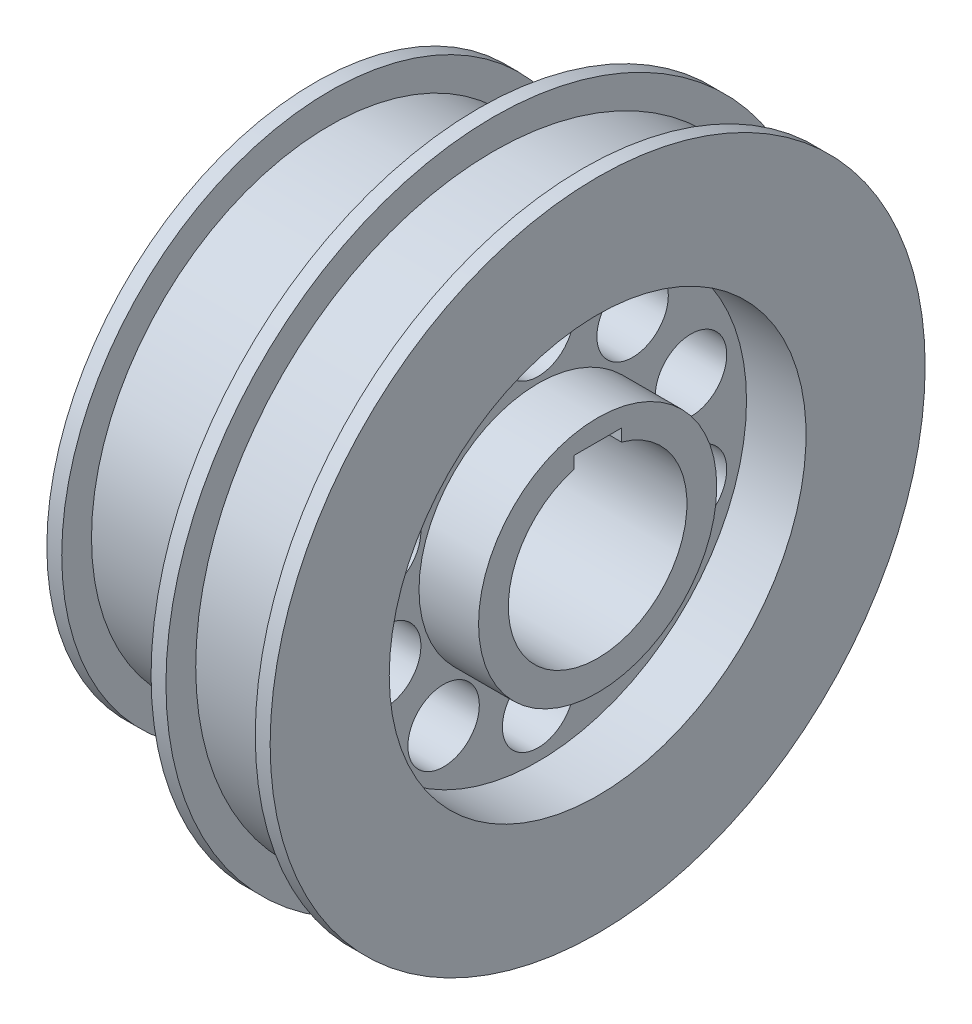
ISO-10303-21;
HEADER;
FILE_DESCRIPTION(('STEP AP214'),'2;1');
FILE_NAME('part.step','',(''),(''),'','','');
FILE_SCHEMA(('AUTOMOTIVE_DESIGN { 1 0 10303 214 1 1 1 1 }'));
ENDSEC;
DATA;
#1=APPLICATION_CONTEXT('core data for automotive mechanical design processes');
#2=APPLICATION_PROTOCOL_DEFINITION('international standard','automotive_design',2000,#1);
#3=PRODUCT_CONTEXT('',#1,'mechanical');
#4=PRODUCT('Part','Part','',(#3));
#5=PRODUCT_RELATED_PRODUCT_CATEGORY('part','',(#4));
#6=PRODUCT_DEFINITION_FORMATION('','',#4);
#7=PRODUCT_DEFINITION_CONTEXT('part definition',#1,'design');
#8=PRODUCT_DEFINITION('design','',#6,#7);
#9=PRODUCT_DEFINITION_SHAPE('','',#8);
#10=(LENGTH_UNIT() NAMED_UNIT(*) SI_UNIT(.MILLI.,.METRE.));
#11=(NAMED_UNIT(*) PLANE_ANGLE_UNIT() SI_UNIT($,.RADIAN.));
#12=(NAMED_UNIT(*) SI_UNIT($,.STERADIAN.) SOLID_ANGLE_UNIT());
#13=UNCERTAINTY_MEASURE_WITH_UNIT(LENGTH_MEASURE(1.E-05),#10,'distance_accuracy_value','');
#14=(GEOMETRIC_REPRESENTATION_CONTEXT(3) GLOBAL_UNCERTAINTY_ASSIGNED_CONTEXT((#13)) GLOBAL_UNIT_ASSIGNED_CONTEXT((#10,
#11,#12)) REPRESENTATION_CONTEXT('',''));
#15=CARTESIAN_POINT('',(0.,0.,0.));
#16=DIRECTION('',(0.,0.,1.));
#17=DIRECTION('',(1.,0.,0.));
#18=AXIS2_PLACEMENT_3D('',#15,#16,#17);
#19=CARTESIAN_POINT('',(-5.,0.,0.));
#20=DIRECTION('',(1.,0.,0.));
#21=DIRECTION('',(0.,0.,-1.));
#22=AXIS2_PLACEMENT_3D('',#19,#20,#21);
#23=PLANE('',#22);
#24=CARTESIAN_POINT('',(-5.,27.,0.));
#25=DIRECTION('',(1.,0.,0.));
#26=DIRECTION('',(0.,0.,-1.));
#27=AXIS2_PLACEMENT_3D('',#24,#25,#26);
#28=CIRCLE('',#27,6.);
#29=CARTESIAN_POINT('',(-5.,27.,-6.));
#30=VERTEX_POINT('',#29);
#31=EDGE_CURVE('E111',#30,#30,#28,.T.);
#32=ORIENTED_EDGE('',*,*,#31,.T.);
#33=EDGE_LOOP('',(#32));
#34=FACE_BOUND('',#33,.T.);
#35=CARTESIAN_POINT('',(-5.,21.8434588481267,-15.8702018118978));
#36=DIRECTION('',(1.,0.,0.));
#37=DIRECTION('',(0.,0.,-1.));
#38=AXIS2_PLACEMENT_3D('',#35,#36,#37);
#39=CIRCLE('',#38,6.0000000000001);
#40=CARTESIAN_POINT('',(-5.,21.8434588481267,-21.8702018118979));
#41=VERTEX_POINT('',#40);
#42=EDGE_CURVE('E179',#41,#41,#39,.T.);
#43=ORIENTED_EDGE('',*,*,#42,.T.);
#44=EDGE_LOOP('',(#43));
#45=FACE_BOUND('',#44,.T.);
#46=CARTESIAN_POINT('',(-5.,8.34345884812869,-25.6785259399729));
#47=DIRECTION('',(1.,0.,0.));
#48=DIRECTION('',(0.,0.,-1.));
#49=AXIS2_PLACEMENT_3D('',#46,#47,#48);
#50=CIRCLE('',#49,6.00000000000213);
#51=CARTESIAN_POINT('',(-5.,8.34345884812869,-31.678525939975));
#52=VERTEX_POINT('',#51);
#53=EDGE_CURVE('E176',#52,#52,#50,.T.);
#54=ORIENTED_EDGE('',*,*,#53,.T.);
#55=EDGE_LOOP('',(#54));
#56=FACE_BOUND('',#55,.T.);
#57=CARTESIAN_POINT('',(-5.,-8.34345884811848,-25.6785259399762));
#58=DIRECTION('',(1.,0.,0.));
#59=DIRECTION('',(0.,0.,-1.));
#60=AXIS2_PLACEMENT_3D('',#57,#58,#59);
#61=CIRCLE('',#60,6.00000000000534);
#62=CARTESIAN_POINT('',(-5.,-8.34345884811848,-31.6785259399815));
#63=VERTEX_POINT('',#62);
#64=EDGE_CURVE('E173',#63,#63,#61,.T.);
#65=ORIENTED_EDGE('',*,*,#64,.T.);
#66=EDGE_LOOP('',(#65));
#67=FACE_BOUND('',#66,.T.);
#68=CARTESIAN_POINT('',(-5.,-21.8434588481204,-15.8702018119065));
#69=DIRECTION('',(1.,0.,0.));
#70=DIRECTION('',(0.,0.,-1.));
#71=AXIS2_PLACEMENT_3D('',#68,#69,#70);
#72=CIRCLE('',#71,6.00000000000851);
#73=CARTESIAN_POINT('',(-5.,-21.8434588481204,-21.870201811915));
#74=VERTEX_POINT('',#73);
#75=EDGE_CURVE('E170',#74,#74,#72,.T.);
#76=ORIENTED_EDGE('',*,*,#75,.T.);
#77=EDGE_LOOP('',(#76));
#78=FACE_BOUND('',#77,.T.);
#79=CARTESIAN_POINT('',(-5.,-27.,-1.07334865256196E-11));
#80=DIRECTION('',(1.,0.,0.));
#81=DIRECTION('',(0.,0.,-1.));
#82=AXIS2_PLACEMENT_3D('',#79,#80,#81);
#83=CIRCLE('',#82,6.00000000001045);
#84=CARTESIAN_POINT('',(-5.,-27.,-6.00000000002118));
#85=VERTEX_POINT('',#84);
#86=EDGE_CURVE('E167',#85,#85,#83,.T.);
#87=ORIENTED_EDGE('',*,*,#86,.T.);
#88=EDGE_LOOP('',(#87));
#89=FACE_BOUND('',#88,.T.);
#90=CARTESIAN_POINT('',(-5.,-21.8434588481267,15.8702018118871));
#91=DIRECTION('',(1.,0.,0.));
#92=DIRECTION('',(0.,0.,-1.));
#93=AXIS2_PLACEMENT_3D('',#90,#91,#92);
#94=CIRCLE('',#93,6.00000000001043);
#95=CARTESIAN_POINT('',(-5.,-21.8434588481267,9.87020181187664));
#96=VERTEX_POINT('',#95);
#97=EDGE_CURVE('E164',#96,#96,#94,.T.);
#98=ORIENTED_EDGE('',*,*,#97,.T.);
#99=EDGE_LOOP('',(#98));
#100=FACE_BOUND('',#99,.T.);
#101=CARTESIAN_POINT('',(-5.,-8.34345884812869,25.6785259399621));
#102=DIRECTION('',(1.,0.,0.));
#103=DIRECTION('',(0.,0.,-1.));
#104=AXIS2_PLACEMENT_3D('',#101,#102,#103);
#105=CIRCLE('',#104,6.00000000000846);
#106=CARTESIAN_POINT('',(-5.,-8.34345884812869,19.6785259399537));
#107=VERTEX_POINT('',#106);
#108=EDGE_CURVE('E161',#107,#107,#105,.T.);
#109=ORIENTED_EDGE('',*,*,#108,.T.);
#110=EDGE_LOOP('',(#109));
#111=FACE_BOUND('',#110,.T.);
#112=CARTESIAN_POINT('',(-5.,8.34345884811847,25.6785259399654));
#113=DIRECTION('',(1.,0.,0.));
#114=DIRECTION('',(0.,0.,-1.));
#115=AXIS2_PLACEMENT_3D('',#112,#113,#114);
#116=CIRCLE('',#115,6.00000000000533);
#117=CARTESIAN_POINT('',(-5.,8.34345884811847,19.6785259399601));
#118=VERTEX_POINT('',#117);
#119=EDGE_CURVE('E158',#118,#118,#116,.T.);
#120=ORIENTED_EDGE('',*,*,#119,.T.);
#121=EDGE_LOOP('',(#120));
#122=FACE_BOUND('',#121,.T.);
#123=CARTESIAN_POINT('',(-5.,21.8434588481204,15.8702018118958));
#124=DIRECTION('',(1.,0.,0.));
#125=DIRECTION('',(0.,0.,-1.));
#126=AXIS2_PLACEMENT_3D('',#123,#124,#125);
#127=CIRCLE('',#126,6.00000000000225);
#128=CARTESIAN_POINT('',(-5.,21.8434588481204,9.87020181189351));
#129=VERTEX_POINT('',#128);
#130=EDGE_CURVE('E155',#129,#129,#127,.T.);
#131=ORIENTED_EDGE('',*,*,#130,.T.);
#132=EDGE_LOOP('',(#131));
#133=FACE_BOUND('',#132,.T.);
#134=CARTESIAN_POINT('',(-5.,0.,0.));
#135=DIRECTION('',(1.,0.,0.));
#136=DIRECTION('',(0.,0.,-1.));
#137=AXIS2_PLACEMENT_3D('',#134,#135,#136);
#138=CIRCLE('',#137,20.);
#139=CARTESIAN_POINT('',(-5.,0.,-20.));
#140=VERTEX_POINT('',#139);
#141=EDGE_CURVE('E107',#140,#140,#138,.F.);
#142=ORIENTED_EDGE('',*,*,#141,.F.);
#143=EDGE_LOOP('',(#142));
#144=FACE_BOUND('',#143,.T.);
#145=CARTESIAN_POINT('',(-5.,0.,0.));
#146=DIRECTION('',(1.,0.,0.));
#147=DIRECTION('',(0.,0.,-1.));
#148=AXIS2_PLACEMENT_3D('',#145,#146,#147);
#149=CIRCLE('',#148,35.);
#150=CARTESIAN_POINT('',(-5.,0.,-35.));
#151=VERTEX_POINT('',#150);
#152=EDGE_CURVE('E102',#151,#151,#149,.T.);
#153=ORIENTED_EDGE('',*,*,#152,.F.);
#154=EDGE_LOOP('',(#153));
#155=FACE_BOUND('',#154,.T.);
#156=ADVANCED_FACE('F37',(#34,#45,#56,#67,#78,#89,#100,#111,#122,#133,#144,#155),#23,.F.);
#157=CARTESIAN_POINT('',(5.,0.,0.));
#158=DIRECTION('',(1.,0.,0.));
#159=DIRECTION('',(0.,0.,-1.));
#160=AXIS2_PLACEMENT_3D('',#157,#158,#159);
#161=PLANE('',#160);
#162=CARTESIAN_POINT('',(5.,21.8434588481204,15.8702018118958));
#163=DIRECTION('',(1.,0.,0.));
#164=DIRECTION('',(0.,0.,-1.));
#165=AXIS2_PLACEMENT_3D('',#162,#163,#164);
#166=CIRCLE('',#165,6.00000000000225);
#167=CARTESIAN_POINT('',(5.,21.8434588481204,9.87020181189351));
#168=VERTEX_POINT('',#167);
#169=EDGE_CURVE('E114',#168,#168,#166,.T.);
#170=ORIENTED_EDGE('',*,*,#169,.F.);
#171=EDGE_LOOP('',(#170));
#172=FACE_BOUND('',#171,.T.);
#173=CARTESIAN_POINT('',(5.,-8.34345884812869,25.6785259399621));
#174=DIRECTION('',(1.,0.,0.));
#175=DIRECTION('',(0.,0.,-1.));
#176=AXIS2_PLACEMENT_3D('',#173,#174,#175);
#177=CIRCLE('',#176,6.00000000000846);
#178=CARTESIAN_POINT('',(5.,-8.34345884812869,19.6785259399537));
#179=VERTEX_POINT('',#178);
#180=EDGE_CURVE('E131',#179,#179,#177,.T.);
#181=ORIENTED_EDGE('',*,*,#180,.F.);
#182=EDGE_LOOP('',(#181));
#183=FACE_BOUND('',#182,.T.);
#184=CARTESIAN_POINT('',(5.,-27.,-1.07334865256196E-11));
#185=DIRECTION('',(1.,0.,0.));
#186=DIRECTION('',(0.,0.,-1.));
#187=AXIS2_PLACEMENT_3D('',#184,#185,#186);
#188=CIRCLE('',#187,6.00000000001045);
#189=CARTESIAN_POINT('',(5.,-27.,-6.00000000002118));
#190=VERTEX_POINT('',#189);
#191=EDGE_CURVE('E137',#190,#190,#188,.T.);
#192=ORIENTED_EDGE('',*,*,#191,.F.);
#193=EDGE_LOOP('',(#192));
#194=FACE_BOUND('',#193,.T.);
#195=CARTESIAN_POINT('',(5.,-8.34345884811848,-25.6785259399762));
#196=DIRECTION('',(1.,0.,0.));
#197=DIRECTION('',(0.,0.,-1.));
#198=AXIS2_PLACEMENT_3D('',#195,#196,#197);
#199=CIRCLE('',#198,6.00000000000534);
#200=CARTESIAN_POINT('',(5.,-8.34345884811848,-31.6785259399815));
#201=VERTEX_POINT('',#200);
#202=EDGE_CURVE('E143',#201,#201,#199,.T.);
#203=ORIENTED_EDGE('',*,*,#202,.F.);
#204=EDGE_LOOP('',(#203));
#205=FACE_BOUND('',#204,.T.);
#206=CARTESIAN_POINT('',(5.,21.8434588481267,-15.8702018118978));
#207=DIRECTION('',(1.,0.,0.));
#208=DIRECTION('',(0.,0.,-1.));
#209=AXIS2_PLACEMENT_3D('',#206,#207,#208);
#210=CIRCLE('',#209,6.0000000000001);
#211=CARTESIAN_POINT('',(5.,21.8434588481267,-21.8702018118979));
#212=VERTEX_POINT('',#211);
#213=EDGE_CURVE('E149',#212,#212,#210,.T.);
#214=ORIENTED_EDGE('',*,*,#213,.F.);
#215=EDGE_LOOP('',(#214));
#216=FACE_BOUND('',#215,.T.);
#217=CARTESIAN_POINT('',(5.,27.,0.));
#218=DIRECTION('',(1.,0.,0.));
#219=DIRECTION('',(0.,0.,-1.));
#220=AXIS2_PLACEMENT_3D('',#217,#218,#219);
#221=CIRCLE('',#220,6.);
#222=CARTESIAN_POINT('',(5.,27.,-6.));
#223=VERTEX_POINT('',#222);
#224=EDGE_CURVE('E152',#223,#223,#221,.T.);
#225=ORIENTED_EDGE('',*,*,#224,.F.);
#226=EDGE_LOOP('',(#225));
#227=FACE_BOUND('',#226,.T.);
#228=CARTESIAN_POINT('',(5.,8.34345884812869,-25.6785259399729));
#229=DIRECTION('',(1.,0.,0.));
#230=DIRECTION('',(0.,0.,-1.));
#231=AXIS2_PLACEMENT_3D('',#228,#229,#230);
#232=CIRCLE('',#231,6.00000000000213);
#233=CARTESIAN_POINT('',(5.,8.34345884812869,-31.678525939975));
#234=VERTEX_POINT('',#233);
#235=EDGE_CURVE('E146',#234,#234,#232,.T.);
#236=ORIENTED_EDGE('',*,*,#235,.F.);
#237=EDGE_LOOP('',(#236));
#238=FACE_BOUND('',#237,.T.);
#239=CARTESIAN_POINT('',(5.,-21.8434588481204,-15.8702018119065));
#240=DIRECTION('',(1.,0.,0.));
#241=DIRECTION('',(0.,0.,-1.));
#242=AXIS2_PLACEMENT_3D('',#239,#240,#241);
#243=CIRCLE('',#242,6.00000000000851);
#244=CARTESIAN_POINT('',(5.,-21.8434588481204,-21.870201811915));
#245=VERTEX_POINT('',#244);
#246=EDGE_CURVE('E140',#245,#245,#243,.T.);
#247=ORIENTED_EDGE('',*,*,#246,.F.);
#248=EDGE_LOOP('',(#247));
#249=FACE_BOUND('',#248,.T.);
#250=CARTESIAN_POINT('',(5.,-21.8434588481267,15.8702018118871));
#251=DIRECTION('',(1.,0.,0.));
#252=DIRECTION('',(0.,0.,-1.));
#253=AXIS2_PLACEMENT_3D('',#250,#251,#252);
#254=CIRCLE('',#253,6.00000000001043);
#255=CARTESIAN_POINT('',(5.,-21.8434588481267,9.87020181187664));
#256=VERTEX_POINT('',#255);
#257=EDGE_CURVE('E134',#256,#256,#254,.T.);
#258=ORIENTED_EDGE('',*,*,#257,.F.);
#259=EDGE_LOOP('',(#258));
#260=FACE_BOUND('',#259,.T.);
#261=CARTESIAN_POINT('',(5.,8.34345884811847,25.6785259399654));
#262=DIRECTION('',(1.,0.,0.));
#263=DIRECTION('',(0.,0.,-1.));
#264=AXIS2_PLACEMENT_3D('',#261,#262,#263);
#265=CIRCLE('',#264,6.00000000000533);
#266=CARTESIAN_POINT('',(5.,8.34345884811847,19.6785259399601));
#267=VERTEX_POINT('',#266);
#268=EDGE_CURVE('E128',#267,#267,#265,.T.);
#269=ORIENTED_EDGE('',*,*,#268,.F.);
#270=EDGE_LOOP('',(#269));
#271=FACE_BOUND('',#270,.T.);
#272=CARTESIAN_POINT('',(5.,0.,0.));
#273=DIRECTION('',(1.,0.,0.));
#274=DIRECTION('',(0.,0.,-1.));
#275=AXIS2_PLACEMENT_3D('',#272,#273,#274);
#276=CIRCLE('',#275,20.);
#277=CARTESIAN_POINT('',(5.,0.,-20.));
#278=VERTEX_POINT('',#277);
#279=EDGE_CURVE('E98',#278,#278,#276,.F.);
#280=ORIENTED_EDGE('',*,*,#279,.T.);
#281=EDGE_LOOP('',(#280));
#282=FACE_BOUND('',#281,.T.);
#283=CARTESIAN_POINT('',(5.,0.,0.));
#284=DIRECTION('',(1.,0.,0.));
#285=DIRECTION('',(0.,0.,-1.));
#286=AXIS2_PLACEMENT_3D('',#283,#284,#285);
#287=CIRCLE('',#286,35.);
#288=CARTESIAN_POINT('',(5.,0.,-35.));
#289=VERTEX_POINT('',#288);
#290=EDGE_CURVE('E112',#289,#289,#287,.T.);
#291=ORIENTED_EDGE('',*,*,#290,.T.);
#292=EDGE_LOOP('',(#291));
#293=FACE_BOUND('',#292,.T.);
#294=ADVANCED_FACE('F216',(#172,#183,#194,#205,#216,#227,#238,#249,#260,#271,#282,#293),#161,.T.);
#295=CARTESIAN_POINT('',(-15.,0.,0.));
#296=DIRECTION('',(1.,0.,0.));
#297=DIRECTION('',(0.,0.,-1.));
#298=AXIS2_PLACEMENT_3D('',#295,#296,#297);
#299=CYLINDRICAL_SURFACE('',#298,20.);
#300=CARTESIAN_POINT('',(-12.5,0.,0.));
#301=DIRECTION('',(1.,0.,0.));
#302=DIRECTION('',(0.,0.,-1.));
#303=AXIS2_PLACEMENT_3D('',#300,#301,#302);
#304=CIRCLE('',#303,20.);
#305=CARTESIAN_POINT('',(-12.5,0.,-20.));
#306=VERTEX_POINT('',#305);
#307=EDGE_CURVE('E45',#306,#306,#304,.T.);
#308=ORIENTED_EDGE('',*,*,#307,.T.);
#309=EDGE_LOOP('',(#308));
#310=FACE_BOUND('',#309,.T.);
#311=ORIENTED_EDGE('',*,*,#141,.T.);
#312=EDGE_LOOP('',(#311));
#313=FACE_BOUND('',#312,.T.);
#314=ADVANCED_FACE('F209',(#310,#313),#299,.T.);
#315=CARTESIAN_POINT('',(-15.,0.,0.));
#316=DIRECTION('',(1.,0.,0.));
#317=DIRECTION('',(0.,0.,-1.));
#318=AXIS2_PLACEMENT_3D('',#315,#316,#317);
#319=CYLINDRICAL_SURFACE('',#318,15.);
#320=CARTESIAN_POINT('',(-10.,0.,0.));
#321=DIRECTION('',(-1.,0.,0.));
#322=DIRECTION('',(0.,0.,1.));
#323=AXIS2_PLACEMENT_3D('',#320,#321,#322);
#324=CIRCLE('',#323,15.);
#325=CARTESIAN_POINT('',(-10.,14.456832294801,4.));
#326=VERTEX_POINT('',#325);
#327=CARTESIAN_POINT('',(-10.,14.456832294801,-4.));
#328=VERTEX_POINT('',#327);
#329=EDGE_CURVE('E52',#326,#328,#324,.F.);
#330=ORIENTED_EDGE('',*,*,#329,.F.);
#331=DIRECTION('',(1.,0.,0.));
#332=VECTOR('',#331,1.);
#333=CARTESIAN_POINT('',(-15.,14.456832294801,4.));
#334=LINE('',#333,#332);
#335=CARTESIAN_POINT('',(15.,14.456832294801,4.));
#336=VERTEX_POINT('',#335);
#337=EDGE_CURVE('E99',#326,#336,#334,.T.);
#338=ORIENTED_EDGE('',*,*,#337,.T.);
#339=CARTESIAN_POINT('',(15.,0.,0.));
#340=DIRECTION('',(1.,0.,0.));
#341=DIRECTION('',(0.,0.,-1.));
#342=AXIS2_PLACEMENT_3D('',#339,#340,#341);
#343=CIRCLE('',#342,15.);
#344=CARTESIAN_POINT('',(15.,14.456832294801,-4.));
#345=VERTEX_POINT('',#344);
#346=EDGE_CURVE('E190',#336,#345,#343,.T.);
#347=ORIENTED_EDGE('',*,*,#346,.T.);
#348=DIRECTION('',(1.,0.,0.));
#349=VECTOR('',#348,1.);
#350=CARTESIAN_POINT('',(-15.,14.456832294801,-4.));
#351=LINE('',#350,#349);
#352=EDGE_CURVE('E89',#328,#345,#351,.T.);
#353=ORIENTED_EDGE('',*,*,#352,.F.);
#354=EDGE_LOOP('',(#330,#338,#347,#353));
#355=FACE_BOUND('',#354,.T.);
#356=ADVANCED_FACE('F207',(#355),#319,.F.);
#357=CARTESIAN_POINT('',(-15.,14.456832294801,4.));
#358=DIRECTION('',(0.,0.,1.));
#359=DIRECTION('',(1.,0.,0.));
#360=AXIS2_PLACEMENT_3D('',#357,#358,#359);
#361=PLANE('',#360);
#362=DIRECTION('',(0.,-1.,0.));
#363=VECTOR('',#362,1.);
#364=CARTESIAN_POINT('',(-10.,14.456832294801,4.));
#365=LINE('',#364,#363);
#366=CARTESIAN_POINT('',(-10.,16.5,4.));
#367=VERTEX_POINT('',#366);
#368=EDGE_CURVE('E59',#367,#326,#365,.T.);
#369=ORIENTED_EDGE('',*,*,#368,.F.);
#370=DIRECTION('',(1.,0.,0.));
#371=VECTOR('',#370,1.);
#372=CARTESIAN_POINT('',(-15.,16.5,4.));
#373=LINE('',#372,#371);
#374=CARTESIAN_POINT('',(15.,16.5,4.));
#375=VERTEX_POINT('',#374);
#376=EDGE_CURVE('E88',#367,#375,#373,.T.);
#377=ORIENTED_EDGE('',*,*,#376,.T.);
#378=DIRECTION('',(0.,-1.,0.));
#379=VECTOR('',#378,1.);
#380=CARTESIAN_POINT('',(15.,14.456832294801,4.));
#381=LINE('',#380,#379);
#382=EDGE_CURVE('E196',#375,#336,#381,.T.);
#383=ORIENTED_EDGE('',*,*,#382,.T.);
#384=ORIENTED_EDGE('',*,*,#337,.F.);
#385=EDGE_LOOP('',(#369,#377,#383,#384));
#386=FACE_BOUND('',#385,.T.);
#387=ADVANCED_FACE('F202',(#386),#361,.F.);
#388=CARTESIAN_POINT('',(-15.,16.5,4.));
#389=DIRECTION('',(0.,1.,0.));
#390=DIRECTION('',(0.,0.,1.));
#391=AXIS2_PLACEMENT_3D('',#388,#389,#390);
#392=PLANE('',#391);
#393=DIRECTION('',(0.,0.,1.));
#394=VECTOR('',#393,1.);
#395=CARTESIAN_POINT('',(-10.,16.5,4.));
#396=LINE('',#395,#394);
#397=CARTESIAN_POINT('',(-10.,16.5,-4.));
#398=VERTEX_POINT('',#397);
#399=EDGE_CURVE('E92',#398,#367,#396,.T.);
#400=ORIENTED_EDGE('',*,*,#399,.F.);
#401=DIRECTION('',(1.,0.,0.));
#402=VECTOR('',#401,1.);
#403=CARTESIAN_POINT('',(-15.,16.5,-4.));
#404=LINE('',#403,#402);
#405=CARTESIAN_POINT('',(15.,16.5,-4.));
#406=VERTEX_POINT('',#405);
#407=EDGE_CURVE('E78',#398,#406,#404,.T.);
#408=ORIENTED_EDGE('',*,*,#407,.T.);
#409=DIRECTION('',(0.,0.,1.));
#410=VECTOR('',#409,1.);
#411=CARTESIAN_POINT('',(15.,16.5,4.));
#412=LINE('',#411,#410);
#413=EDGE_CURVE('E194',#406,#375,#412,.T.);
#414=ORIENTED_EDGE('',*,*,#413,.T.);
#415=ORIENTED_EDGE('',*,*,#376,.F.);
#416=EDGE_LOOP('',(#400,#408,#414,#415));
#417=FACE_BOUND('',#416,.T.);
#418=ADVANCED_FACE('F93',(#417),#392,.F.);
#419=CARTESIAN_POINT('',(-15.,14.456832294801,-4.));
#420=DIRECTION('',(0.,0.,-1.));
#421=DIRECTION('',(-1.,0.,0.));
#422=AXIS2_PLACEMENT_3D('',#419,#420,#421);
#423=PLANE('',#422);
#424=DIRECTION('',(0.,1.,0.));
#425=VECTOR('',#424,1.);
#426=CARTESIAN_POINT('',(-10.,14.456832294801,-4.));
#427=LINE('',#426,#425);
#428=EDGE_CURVE('E82',#328,#398,#427,.T.);
#429=ORIENTED_EDGE('',*,*,#428,.F.);
#430=ORIENTED_EDGE('',*,*,#352,.T.);
#431=DIRECTION('',(0.,1.,0.));
#432=VECTOR('',#431,1.);
#433=CARTESIAN_POINT('',(15.,14.456832294801,-4.));
#434=LINE('',#433,#432);
#435=EDGE_CURVE('E84',#345,#406,#434,.T.);
#436=ORIENTED_EDGE('',*,*,#435,.T.);
#437=ORIENTED_EDGE('',*,*,#407,.F.);
#438=EDGE_LOOP('',(#429,#430,#436,#437));
#439=FACE_BOUND('',#438,.T.);
#440=ADVANCED_FACE('F80',(#439),#423,.F.);
#441=ORIENTED_EDGE('',*,*,#279,.F.);
#442=EDGE_LOOP('',(#441));
#443=FACE_BOUND('',#442,.T.);
#444=CARTESIAN_POINT('',(15.,0.,0.));
#445=DIRECTION('',(1.,0.,0.));
#446=DIRECTION('',(0.,0.,-1.));
#447=AXIS2_PLACEMENT_3D('',#444,#445,#446);
#448=CIRCLE('',#447,20.);
#449=CARTESIAN_POINT('',(15.,0.,-20.));
#450=VERTEX_POINT('',#449);
#451=EDGE_CURVE('E199',#450,#450,#448,.T.);
#452=ORIENTED_EDGE('',*,*,#451,.F.);
#453=EDGE_LOOP('',(#452));
#454=FACE_BOUND('',#453,.T.);
#455=ADVANCED_FACE('F217',(#443,#454),#299,.T.);
#456=CARTESIAN_POINT('',(-15.,0.,0.));
#457=DIRECTION('',(1.,0.,0.));
#458=DIRECTION('',(0.,0.,-1.));
#459=AXIS2_PLACEMENT_3D('',#456,#457,#458);
#460=PLANE('',#459);
#461=CARTESIAN_POINT('',(-15.,0.,0.));
#462=DIRECTION('',(1.,0.,0.));
#463=DIRECTION('',(0.,0.,-1.));
#464=AXIS2_PLACEMENT_3D('',#461,#462,#463);
#465=CIRCLE('',#464,17.5);
#466=CARTESIAN_POINT('',(-15.,0.,-17.5));
#467=VERTEX_POINT('',#466);
#468=EDGE_CURVE('E11',#467,#467,#465,.F.);
#469=ORIENTED_EDGE('',*,*,#468,.T.);
#470=EDGE_LOOP('',(#469));
#471=FACE_BOUND('',#470,.T.);
#472=CARTESIAN_POINT('',(-15.,0.,0.));
#473=DIRECTION('',(-1.,0.,0.));
#474=DIRECTION('',(0.,0.,1.));
#475=AXIS2_PLACEMENT_3D('',#472,#473,#474);
#476=CIRCLE('',#475,6.5);
#477=CARTESIAN_POINT('',(-15.,0.,6.5));
#478=VERTEX_POINT('',#477);
#479=EDGE_CURVE('E110',#478,#478,#476,.T.);
#480=ORIENTED_EDGE('',*,*,#479,.F.);
#481=EDGE_LOOP('',(#480));
#482=FACE_BOUND('',#481,.T.);
#483=ADVANCED_FACE('F241',(#471,#482),#460,.F.);
#484=CARTESIAN_POINT('',(15.,0.,0.));
#485=DIRECTION('',(1.,0.,0.));
#486=DIRECTION('',(0.,0.,-1.));
#487=AXIS2_PLACEMENT_3D('',#484,#485,#486);
#488=PLANE('',#487);
#489=ORIENTED_EDGE('',*,*,#451,.T.);
#490=EDGE_LOOP('',(#489));
#491=FACE_BOUND('',#490,.T.);
#492=ORIENTED_EDGE('',*,*,#435,.F.);
#493=ORIENTED_EDGE('',*,*,#346,.F.);
#494=ORIENTED_EDGE('',*,*,#382,.F.);
#495=ORIENTED_EDGE('',*,*,#413,.F.);
#496=EDGE_LOOP('',(#492,#493,#494,#495));
#497=FACE_BOUND('',#496,.T.);
#498=ADVANCED_FACE('F206',(#491,#497),#488,.T.);
#499=CARTESIAN_POINT('',(-10.,0.,0.));
#500=DIRECTION('',(-1.,0.,0.));
#501=DIRECTION('',(0.,0.,1.));
#502=AXIS2_PLACEMENT_3D('',#499,#500,#501);
#503=PLANE('',#502);
#504=CARTESIAN_POINT('',(-10.,0.,0.));
#505=DIRECTION('',(-1.,0.,0.));
#506=DIRECTION('',(0.,0.,1.));
#507=AXIS2_PLACEMENT_3D('',#504,#505,#506);
#508=CIRCLE('',#507,6.5);
#509=CARTESIAN_POINT('',(-10.,0.,6.5));
#510=VERTEX_POINT('',#509);
#511=EDGE_CURVE('E95',#510,#510,#508,.T.);
#512=ORIENTED_EDGE('',*,*,#511,.T.);
#513=EDGE_LOOP('',(#512));
#514=FACE_BOUND('',#513,.T.);
#515=ORIENTED_EDGE('',*,*,#368,.T.);
#516=ORIENTED_EDGE('',*,*,#329,.T.);
#517=ORIENTED_EDGE('',*,*,#428,.T.);
#518=ORIENTED_EDGE('',*,*,#399,.T.);
#519=EDGE_LOOP('',(#515,#516,#517,#518));
#520=FACE_BOUND('',#519,.T.);
#521=ADVANCED_FACE('F97',(#514,#520),#503,.F.);
#522=CARTESIAN_POINT('',(-10.,0.,0.));
#523=DIRECTION('',(-1.,0.,0.));
#524=DIRECTION('',(0.,0.,1.));
#525=AXIS2_PLACEMENT_3D('',#522,#523,#524);
#526=CYLINDRICAL_SURFACE('',#525,6.5);
#527=ORIENTED_EDGE('',*,*,#511,.F.);
#528=EDGE_LOOP('',(#527));
#529=FACE_BOUND('',#528,.T.);
#530=ORIENTED_EDGE('',*,*,#479,.T.);
#531=EDGE_LOOP('',(#530));
#532=FACE_BOUND('',#531,.T.);
#533=ADVANCED_FACE('F233',(#529,#532),#526,.F.);
#534=CARTESIAN_POINT('',(-5.,27.,0.));
#535=DIRECTION('',(1.,0.,0.));
#536=DIRECTION('',(0.,0.,-1.));
#537=AXIS2_PLACEMENT_3D('',#534,#535,#536);
#538=CYLINDRICAL_SURFACE('',#537,6.);
#539=ORIENTED_EDGE('',*,*,#31,.F.);
#540=EDGE_LOOP('',(#539));
#541=FACE_BOUND('',#540,.T.);
#542=ORIENTED_EDGE('',*,*,#224,.T.);
#543=EDGE_LOOP('',(#542));
#544=FACE_BOUND('',#543,.T.);
#545=ADVANCED_FACE('F231',(#541,#544),#538,.F.);
#546=CARTESIAN_POINT('',(-5.,21.8434588481267,-15.8702018118978));
#547=DIRECTION('',(1.,0.,0.));
#548=DIRECTION('',(0.,0.,-1.));
#549=AXIS2_PLACEMENT_3D('',#546,#547,#548);
#550=CYLINDRICAL_SURFACE('',#549,6.0000000000001);
#551=ORIENTED_EDGE('',*,*,#42,.F.);
#552=EDGE_LOOP('',(#551));
#553=FACE_BOUND('',#552,.T.);
#554=ORIENTED_EDGE('',*,*,#213,.T.);
#555=EDGE_LOOP('',(#554));
#556=FACE_BOUND('',#555,.T.);
#557=ADVANCED_FACE('F348',(#553,#556),#550,.F.);
#558=CARTESIAN_POINT('',(-5.,8.34345884812869,-25.6785259399729));
#559=DIRECTION('',(1.,0.,0.));
#560=DIRECTION('',(0.,0.,-1.));
#561=AXIS2_PLACEMENT_3D('',#558,#559,#560);
#562=CYLINDRICAL_SURFACE('',#561,6.00000000000213);
#563=ORIENTED_EDGE('',*,*,#53,.F.);
#564=EDGE_LOOP('',(#563));
#565=FACE_BOUND('',#564,.T.);
#566=ORIENTED_EDGE('',*,*,#235,.T.);
#567=EDGE_LOOP('',(#566));
#568=FACE_BOUND('',#567,.T.);
#569=ADVANCED_FACE('F345',(#565,#568),#562,.F.);
#570=CARTESIAN_POINT('',(-5.,-8.34345884811848,-25.6785259399762));
#571=DIRECTION('',(1.,0.,0.));
#572=DIRECTION('',(0.,0.,-1.));
#573=AXIS2_PLACEMENT_3D('',#570,#571,#572);
#574=CYLINDRICAL_SURFACE('',#573,6.00000000000534);
#575=ORIENTED_EDGE('',*,*,#64,.F.);
#576=EDGE_LOOP('',(#575));
#577=FACE_BOUND('',#576,.T.);
#578=ORIENTED_EDGE('',*,*,#202,.T.);
#579=EDGE_LOOP('',(#578));
#580=FACE_BOUND('',#579,.T.);
#581=ADVANCED_FACE('F341',(#577,#580),#574,.F.);
#582=CARTESIAN_POINT('',(-5.,-21.8434588481204,-15.8702018119065));
#583=DIRECTION('',(1.,0.,0.));
#584=DIRECTION('',(0.,0.,-1.));
#585=AXIS2_PLACEMENT_3D('',#582,#583,#584);
#586=CYLINDRICAL_SURFACE('',#585,6.00000000000851);
#587=ORIENTED_EDGE('',*,*,#75,.F.);
#588=EDGE_LOOP('',(#587));
#589=FACE_BOUND('',#588,.T.);
#590=ORIENTED_EDGE('',*,*,#246,.T.);
#591=EDGE_LOOP('',(#590));
#592=FACE_BOUND('',#591,.T.);
#593=ADVANCED_FACE('F337',(#589,#592),#586,.F.);
#594=CARTESIAN_POINT('',(-5.,-27.,-1.07334865256196E-11));
#595=DIRECTION('',(1.,0.,0.));
#596=DIRECTION('',(0.,0.,-1.));
#597=AXIS2_PLACEMENT_3D('',#594,#595,#596);
#598=CYLINDRICAL_SURFACE('',#597,6.00000000001045);
#599=ORIENTED_EDGE('',*,*,#86,.F.);
#600=EDGE_LOOP('',(#599));
#601=FACE_BOUND('',#600,.T.);
#602=ORIENTED_EDGE('',*,*,#191,.T.);
#603=EDGE_LOOP('',(#602));
#604=FACE_BOUND('',#603,.T.);
#605=ADVANCED_FACE('F333',(#601,#604),#598,.F.);
#606=CARTESIAN_POINT('',(-5.,-21.8434588481267,15.8702018118871));
#607=DIRECTION('',(1.,0.,0.));
#608=DIRECTION('',(0.,0.,-1.));
#609=AXIS2_PLACEMENT_3D('',#606,#607,#608);
#610=CYLINDRICAL_SURFACE('',#609,6.00000000001043);
#611=ORIENTED_EDGE('',*,*,#97,.F.);
#612=EDGE_LOOP('',(#611));
#613=FACE_BOUND('',#612,.T.);
#614=ORIENTED_EDGE('',*,*,#257,.T.);
#615=EDGE_LOOP('',(#614));
#616=FACE_BOUND('',#615,.T.);
#617=ADVANCED_FACE('F329',(#613,#616),#610,.F.);
#618=CARTESIAN_POINT('',(-5.,-8.34345884812869,25.6785259399621));
#619=DIRECTION('',(1.,0.,0.));
#620=DIRECTION('',(0.,0.,-1.));
#621=AXIS2_PLACEMENT_3D('',#618,#619,#620);
#622=CYLINDRICAL_SURFACE('',#621,6.00000000000846);
#623=ORIENTED_EDGE('',*,*,#108,.F.);
#624=EDGE_LOOP('',(#623));
#625=FACE_BOUND('',#624,.T.);
#626=ORIENTED_EDGE('',*,*,#180,.T.);
#627=EDGE_LOOP('',(#626));
#628=FACE_BOUND('',#627,.T.);
#629=ADVANCED_FACE('F325',(#625,#628),#622,.F.);
#630=CARTESIAN_POINT('',(-5.,8.34345884811847,25.6785259399654));
#631=DIRECTION('',(1.,0.,0.));
#632=DIRECTION('',(0.,0.,-1.));
#633=AXIS2_PLACEMENT_3D('',#630,#631,#632);
#634=CYLINDRICAL_SURFACE('',#633,6.00000000000533);
#635=ORIENTED_EDGE('',*,*,#119,.F.);
#636=EDGE_LOOP('',(#635));
#637=FACE_BOUND('',#636,.T.);
#638=ORIENTED_EDGE('',*,*,#268,.T.);
#639=EDGE_LOOP('',(#638));
#640=FACE_BOUND('',#639,.T.);
#641=ADVANCED_FACE('F321',(#637,#640),#634,.F.);
#642=CARTESIAN_POINT('',(-5.,21.8434588481204,15.8702018118958));
#643=DIRECTION('',(1.,0.,0.));
#644=DIRECTION('',(0.,0.,-1.));
#645=AXIS2_PLACEMENT_3D('',#642,#643,#644);
#646=CYLINDRICAL_SURFACE('',#645,6.00000000000225);
#647=ORIENTED_EDGE('',*,*,#130,.F.);
#648=EDGE_LOOP('',(#647));
#649=FACE_BOUND('',#648,.T.);
#650=ORIENTED_EDGE('',*,*,#169,.T.);
#651=EDGE_LOOP('',(#650));
#652=FACE_BOUND('',#651,.T.);
#653=ADVANCED_FACE('F318',(#649,#652),#646,.F.);
#654=CARTESIAN_POINT('',(0.,0.,0.));
#655=DIRECTION('',(-1.,0.,0.));
#656=DIRECTION('',(0.,0.,1.));
#657=AXIS2_PLACEMENT_3D('',#654,#655,#656);
#658=CYLINDRICAL_SURFACE('',#657,35.);
#659=CARTESIAN_POINT('',(-32.5,0.,0.));
#660=DIRECTION('',(-1.,0.,0.));
#661=DIRECTION('',(0.,0.,1.));
#662=AXIS2_PLACEMENT_3D('',#659,#660,#661);
#663=CIRCLE('',#662,35.);
#664=CARTESIAN_POINT('',(-32.5,0.,35.));
#665=VERTEX_POINT('',#664);
#666=EDGE_CURVE('E115',#665,#665,#663,.T.);
#667=ORIENTED_EDGE('',*,*,#666,.T.);
#668=EDGE_LOOP('',(#667));
#669=FACE_BOUND('',#668,.T.);
#670=ORIENTED_EDGE('',*,*,#152,.T.);
#671=EDGE_LOOP('',(#670));
#672=FACE_BOUND('',#671,.T.);
#673=ADVANCED_FACE('F265',(#669,#672),#658,.F.);
#674=ORIENTED_EDGE('',*,*,#290,.F.);
#675=EDGE_LOOP('',(#674));
#676=FACE_BOUND('',#675,.T.);
#677=CARTESIAN_POINT('',(15.,0.,0.));
#678=DIRECTION('',(-1.,0.,0.));
#679=DIRECTION('',(0.,0.,1.));
#680=AXIS2_PLACEMENT_3D('',#677,#678,#679);
#681=CIRCLE('',#680,35.);
#682=CARTESIAN_POINT('',(15.,0.,35.));
#683=VERTEX_POINT('',#682);
#684=EDGE_CURVE('E269',#683,#683,#681,.T.);
#685=ORIENTED_EDGE('',*,*,#684,.F.);
#686=EDGE_LOOP('',(#685));
#687=FACE_BOUND('',#686,.T.);
#688=ADVANCED_FACE('F261',(#676,#687),#658,.F.);
#689=CARTESIAN_POINT('',(-32.5,35.,0.));
#690=DIRECTION('',(1.,0.,0.));
#691=DIRECTION('',(0.,0.,-1.));
#692=AXIS2_PLACEMENT_3D('',#689,#690,#691);
#693=PLANE('',#692);
#694=ORIENTED_EDGE('',*,*,#666,.F.);
#695=EDGE_LOOP('',(#694));
#696=FACE_BOUND('',#695,.T.);
#697=CARTESIAN_POINT('',(-32.5,0.,0.));
#698=DIRECTION('',(-1.,0.,0.));
#699=DIRECTION('',(0.,0.,1.));
#700=AXIS2_PLACEMENT_3D('',#697,#698,#699);
#701=CIRCLE('',#700,45.);
#702=CARTESIAN_POINT('',(-32.5,0.,45.));
#703=VERTEX_POINT('',#702);
#704=EDGE_CURVE('E299',#703,#703,#701,.T.);
#705=ORIENTED_EDGE('',*,*,#704,.T.);
#706=EDGE_LOOP('',(#705));
#707=FACE_BOUND('',#706,.T.);
#708=ADVANCED_FACE('F264',(#696,#707),#693,.F.);
#709=CARTESIAN_POINT('',(0.,0.,0.));
#710=DIRECTION('',(-1.,0.,0.));
#711=DIRECTION('',(0.,0.,1.));
#712=AXIS2_PLACEMENT_3D('',#709,#710,#711);
#713=CYLINDRICAL_SURFACE('',#712,45.);
#714=ORIENTED_EDGE('',*,*,#704,.F.);
#715=EDGE_LOOP('',(#714));
#716=FACE_BOUND('',#715,.T.);
#717=CARTESIAN_POINT('',(-30.,0.,0.));
#718=DIRECTION('',(-1.,0.,0.));
#719=DIRECTION('',(0.,0.,1.));
#720=AXIS2_PLACEMENT_3D('',#717,#718,#719);
#721=CIRCLE('',#720,45.);
#722=CARTESIAN_POINT('',(-30.,0.,45.));
#723=VERTEX_POINT('',#722);
#724=EDGE_CURVE('E297',#723,#723,#721,.T.);
#725=ORIENTED_EDGE('',*,*,#724,.T.);
#726=EDGE_LOOP('',(#725));
#727=FACE_BOUND('',#726,.T.);
#728=ADVANCED_FACE('F308',(#716,#727),#713,.T.);
#729=CARTESIAN_POINT('',(-30.,45.,0.));
#730=DIRECTION('',(-1.,0.,0.));
#731=DIRECTION('',(0.,0.,1.));
#732=AXIS2_PLACEMENT_3D('',#729,#730,#731);
#733=PLANE('',#732);
#734=ORIENTED_EDGE('',*,*,#724,.F.);
#735=EDGE_LOOP('',(#734));
#736=FACE_BOUND('',#735,.T.);
#737=CARTESIAN_POINT('',(-30.,0.,0.));
#738=DIRECTION('',(-1.,0.,0.));
#739=DIRECTION('',(0.,0.,1.));
#740=AXIS2_PLACEMENT_3D('',#737,#738,#739);
#741=CIRCLE('',#740,40.);
#742=CARTESIAN_POINT('',(-30.,0.,40.));
#743=VERTEX_POINT('',#742);
#744=EDGE_CURVE('E294',#743,#743,#741,.T.);
#745=ORIENTED_EDGE('',*,*,#744,.T.);
#746=EDGE_LOOP('',(#745));
#747=FACE_BOUND('',#746,.T.);
#748=ADVANCED_FACE('F313',(#736,#747),#733,.F.);
#749=CARTESIAN_POINT('',(0.,0.,0.));
#750=DIRECTION('',(-1.,0.,0.));
#751=DIRECTION('',(0.,0.,1.));
#752=AXIS2_PLACEMENT_3D('',#749,#750,#751);
#753=CYLINDRICAL_SURFACE('',#752,40.);
#754=ORIENTED_EDGE('',*,*,#744,.F.);
#755=EDGE_LOOP('',(#754));
#756=FACE_BOUND('',#755,.T.);
#757=CARTESIAN_POINT('',(-5.,0.,0.));
#758=DIRECTION('',(-1.,0.,0.));
#759=DIRECTION('',(0.,0.,1.));
#760=AXIS2_PLACEMENT_3D('',#757,#758,#759);
#761=CIRCLE('',#760,40.);
#762=CARTESIAN_POINT('',(-5.,0.,40.));
#763=VERTEX_POINT('',#762);
#764=EDGE_CURVE('E291',#763,#763,#761,.T.);
#765=ORIENTED_EDGE('',*,*,#764,.T.);
#766=EDGE_LOOP('',(#765));
#767=FACE_BOUND('',#766,.T.);
#768=ADVANCED_FACE('F495',(#756,#767),#753,.T.);
#769=CARTESIAN_POINT('',(-5.,40.,0.));
#770=DIRECTION('',(1.,0.,0.));
#771=DIRECTION('',(0.,0.,-1.));
#772=AXIS2_PLACEMENT_3D('',#769,#770,#771);
#773=PLANE('',#772);
#774=ORIENTED_EDGE('',*,*,#764,.F.);
#775=EDGE_LOOP('',(#774));
#776=FACE_BOUND('',#775,.T.);
#777=CARTESIAN_POINT('',(-5.,0.,0.));
#778=DIRECTION('',(-1.,0.,0.));
#779=DIRECTION('',(0.,0.,1.));
#780=AXIS2_PLACEMENT_3D('',#777,#778,#779);
#781=CIRCLE('',#780,55.);
#782=CARTESIAN_POINT('',(-5.,0.,55.));
#783=VERTEX_POINT('',#782);
#784=EDGE_CURVE('E288',#783,#783,#781,.T.);
#785=ORIENTED_EDGE('',*,*,#784,.T.);
#786=EDGE_LOOP('',(#785));
#787=FACE_BOUND('',#786,.T.);
#788=ADVANCED_FACE('F487',(#776,#787),#773,.F.);
#789=CARTESIAN_POINT('',(0.,0.,0.));
#790=DIRECTION('',(-1.,0.,0.));
#791=DIRECTION('',(0.,0.,1.));
#792=AXIS2_PLACEMENT_3D('',#789,#790,#791);
#793=CYLINDRICAL_SURFACE('',#792,55.);
#794=ORIENTED_EDGE('',*,*,#784,.F.);
#795=EDGE_LOOP('',(#794));
#796=FACE_BOUND('',#795,.T.);
#797=CARTESIAN_POINT('',(-2.5,0.,0.));
#798=DIRECTION('',(-1.,0.,0.));
#799=DIRECTION('',(0.,0.,1.));
#800=AXIS2_PLACEMENT_3D('',#797,#798,#799);
#801=CIRCLE('',#800,55.);
#802=CARTESIAN_POINT('',(-2.5,0.,55.));
#803=VERTEX_POINT('',#802);
#804=EDGE_CURVE('E285',#803,#803,#801,.T.);
#805=ORIENTED_EDGE('',*,*,#804,.T.);
#806=EDGE_LOOP('',(#805));
#807=FACE_BOUND('',#806,.T.);
#808=ADVANCED_FACE('F479',(#796,#807),#793,.T.);
#809=CARTESIAN_POINT('',(-2.5,55.,0.));
#810=DIRECTION('',(-1.,0.,0.));
#811=DIRECTION('',(0.,0.,1.));
#812=AXIS2_PLACEMENT_3D('',#809,#810,#811);
#813=PLANE('',#812);
#814=ORIENTED_EDGE('',*,*,#804,.F.);
#815=EDGE_LOOP('',(#814));
#816=FACE_BOUND('',#815,.T.);
#817=CARTESIAN_POINT('',(-2.5,0.,0.));
#818=DIRECTION('',(-1.,0.,0.));
#819=DIRECTION('',(0.,0.,1.));
#820=AXIS2_PLACEMENT_3D('',#817,#818,#819);
#821=CIRCLE('',#820,50.);
#822=CARTESIAN_POINT('',(-2.5,0.,50.));
#823=VERTEX_POINT('',#822);
#824=EDGE_CURVE('E282',#823,#823,#821,.T.);
#825=ORIENTED_EDGE('',*,*,#824,.T.);
#826=EDGE_LOOP('',(#825));
#827=FACE_BOUND('',#826,.T.);
#828=ADVANCED_FACE('F471',(#816,#827),#813,.F.);
#829=CARTESIAN_POINT('',(0.,0.,0.));
#830=DIRECTION('',(-1.,0.,0.));
#831=DIRECTION('',(0.,0.,1.));
#832=AXIS2_PLACEMENT_3D('',#829,#830,#831);
#833=CYLINDRICAL_SURFACE('',#832,50.);
#834=ORIENTED_EDGE('',*,*,#824,.F.);
#835=EDGE_LOOP('',(#834));
#836=FACE_BOUND('',#835,.T.);
#837=CARTESIAN_POINT('',(12.5,0.,0.));
#838=DIRECTION('',(-1.,0.,0.));
#839=DIRECTION('',(0.,0.,1.));
#840=AXIS2_PLACEMENT_3D('',#837,#838,#839);
#841=CIRCLE('',#840,50.);
#842=CARTESIAN_POINT('',(12.5,0.,50.));
#843=VERTEX_POINT('',#842);
#844=EDGE_CURVE('E279',#843,#843,#841,.T.);
#845=ORIENTED_EDGE('',*,*,#844,.T.);
#846=EDGE_LOOP('',(#845));
#847=FACE_BOUND('',#846,.T.);
#848=ADVANCED_FACE('F463',(#836,#847),#833,.T.);
#849=CARTESIAN_POINT('',(12.5,50.,0.));
#850=DIRECTION('',(1.,0.,0.));
#851=DIRECTION('',(0.,0.,-1.));
#852=AXIS2_PLACEMENT_3D('',#849,#850,#851);
#853=PLANE('',#852);
#854=ORIENTED_EDGE('',*,*,#844,.F.);
#855=EDGE_LOOP('',(#854));
#856=FACE_BOUND('',#855,.T.);
#857=CARTESIAN_POINT('',(12.5,0.,0.));
#858=DIRECTION('',(-1.,0.,0.));
#859=DIRECTION('',(0.,0.,1.));
#860=AXIS2_PLACEMENT_3D('',#857,#858,#859);
#861=CIRCLE('',#860,55.);
#862=CARTESIAN_POINT('',(12.5,0.,55.));
#863=VERTEX_POINT('',#862);
#864=EDGE_CURVE('E274',#863,#863,#861,.T.);
#865=ORIENTED_EDGE('',*,*,#864,.T.);
#866=EDGE_LOOP('',(#865));
#867=FACE_BOUND('',#866,.T.);
#868=ADVANCED_FACE('F455',(#856,#867),#853,.F.);
#869=CARTESIAN_POINT('',(0.,0.,0.));
#870=DIRECTION('',(-1.,0.,0.));
#871=DIRECTION('',(0.,0.,1.));
#872=AXIS2_PLACEMENT_3D('',#869,#870,#871);
#873=CYLINDRICAL_SURFACE('',#872,55.);
#874=ORIENTED_EDGE('',*,*,#864,.F.);
#875=EDGE_LOOP('',(#874));
#876=FACE_BOUND('',#875,.T.);
#877=CARTESIAN_POINT('',(15.,0.,0.));
#878=DIRECTION('',(-1.,0.,0.));
#879=DIRECTION('',(0.,0.,1.));
#880=AXIS2_PLACEMENT_3D('',#877,#878,#879);
#881=CIRCLE('',#880,55.);
#882=CARTESIAN_POINT('',(15.,0.,55.));
#883=VERTEX_POINT('',#882);
#884=EDGE_CURVE('E271',#883,#883,#881,.T.);
#885=ORIENTED_EDGE('',*,*,#884,.T.);
#886=EDGE_LOOP('',(#885));
#887=FACE_BOUND('',#886,.T.);
#888=ADVANCED_FACE('F448',(#876,#887),#873,.T.);
#889=CARTESIAN_POINT('',(15.,55.,0.));
#890=DIRECTION('',(-1.,0.,0.));
#891=DIRECTION('',(0.,0.,1.));
#892=AXIS2_PLACEMENT_3D('',#889,#890,#891);
#893=PLANE('',#892);
#894=ORIENTED_EDGE('',*,*,#884,.F.);
#895=EDGE_LOOP('',(#894));
#896=FACE_BOUND('',#895,.T.);
#897=ORIENTED_EDGE('',*,*,#684,.T.);
#898=EDGE_LOOP('',(#897));
#899=FACE_BOUND('',#898,.T.);
#900=ADVANCED_FACE('F439',(#896,#899),#893,.F.);
#901=CARTESIAN_POINT('',(-12.5,0.,0.));
#902=DIRECTION('',(1.,0.,0.));
#903=DIRECTION('',(0.,0.,-1.));
#904=AXIS2_PLACEMENT_3D('',#901,#902,#903);
#905=TOROIDAL_SURFACE('',#904,17.5,2.5);
#906=ORIENTED_EDGE('',*,*,#468,.F.);
#907=EDGE_LOOP('',(#906));
#908=FACE_BOUND('',#907,.T.);
#909=ORIENTED_EDGE('',*,*,#307,.F.);
#910=EDGE_LOOP('',(#909));
#911=FACE_BOUND('',#910,.T.);
#912=ADVANCED_FACE('F39',(#908,#911),#905,.T.);
#913=CLOSED_SHELL('',(#156,#294,#314,#356,#387,#418,#440,#455,#483,#498,#521,#533,#545,#557,
#569,#581,#593,#605,#617,#629,#641,#653,#673,#688,#708,#728,#748,#768,#788,#808,#828,#848,#868,
#888,#900,#912));
#914=MANIFOLD_SOLID_BREP('B2',#913);
#915=ADVANCED_BREP_SHAPE_REPRESENTATION('',(#18,#914),#14);
#916=SHAPE_DEFINITION_REPRESENTATION(#9,#915);
ENDSEC;
END-ISO-10303-21;
